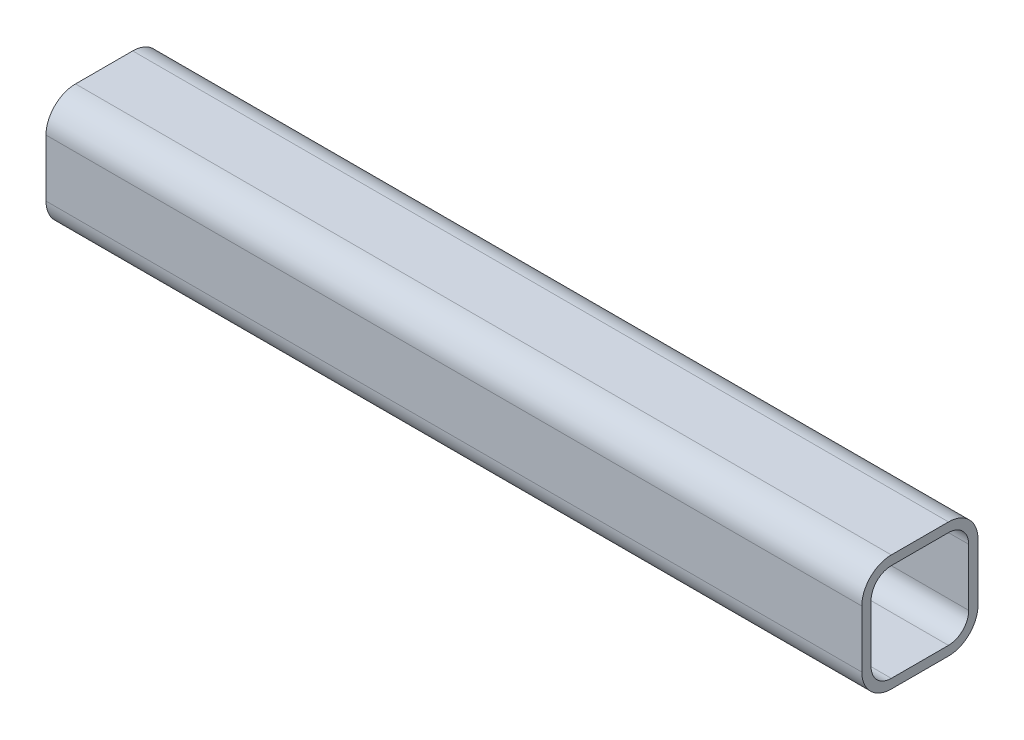
ISO-10303-21;
HEADER;
FILE_DESCRIPTION(('STEP AP214'),'2;1');
FILE_NAME('part.step','',(''),(''),'','','');
FILE_SCHEMA(('AUTOMOTIVE_DESIGN { 1 0 10303 214 1 1 1 1 }'));
ENDSEC;
DATA;
#1=APPLICATION_CONTEXT('core data for automotive mechanical design processes');
#2=APPLICATION_PROTOCOL_DEFINITION('international standard','automotive_design',2000,#1);
#3=PRODUCT_CONTEXT('',#1,'mechanical');
#4=PRODUCT('Part','Part','',(#3));
#5=PRODUCT_RELATED_PRODUCT_CATEGORY('part','',(#4));
#6=PRODUCT_DEFINITION_FORMATION('','',#4);
#7=PRODUCT_DEFINITION_CONTEXT('part definition',#1,'design');
#8=PRODUCT_DEFINITION('design','',#6,#7);
#9=PRODUCT_DEFINITION_SHAPE('','',#8);
#10=(LENGTH_UNIT() NAMED_UNIT(*) SI_UNIT(.MILLI.,.METRE.));
#11=(NAMED_UNIT(*) PLANE_ANGLE_UNIT() SI_UNIT($,.RADIAN.));
#12=(NAMED_UNIT(*) SI_UNIT($,.STERADIAN.) SOLID_ANGLE_UNIT());
#13=UNCERTAINTY_MEASURE_WITH_UNIT(LENGTH_MEASURE(1.E-05),#10,'distance_accuracy_value','');
#14=(GEOMETRIC_REPRESENTATION_CONTEXT(3) GLOBAL_UNCERTAINTY_ASSIGNED_CONTEXT((#13)) GLOBAL_UNIT_ASSIGNED_CONTEXT((#10,
#11,#12)) REPRESENTATION_CONTEXT('',''));
#15=CARTESIAN_POINT('',(0.,0.,0.));
#16=DIRECTION('',(0.,0.,1.));
#17=DIRECTION('',(1.,0.,0.));
#18=AXIS2_PLACEMENT_3D('',#15,#16,#17);
#19=CARTESIAN_POINT('',(172.691234665611,12.3,12.3));
#20=DIRECTION('',(-1.,0.,0.));
#21=DIRECTION('',(0.,0.,1.));
#22=AXIS2_PLACEMENT_3D('',#19,#20,#21);
#23=CYLINDRICAL_SURFACE('',#22,12.7);
#24=CARTESIAN_POINT('',(-178.308765334389,12.3,12.3));
#25=DIRECTION('',(1.,0.,0.));
#26=DIRECTION('',(0.,0.,-1.));
#27=AXIS2_PLACEMENT_3D('',#24,#25,#26);
#28=CIRCLE('',#27,12.7);
#29=CARTESIAN_POINT('',(-178.308765334389,25.,12.3));
#30=VERTEX_POINT('',#29);
#31=CARTESIAN_POINT('',(-178.308765334389,12.3,25.));
#32=VERTEX_POINT('',#31);
#33=EDGE_CURVE('E238',#30,#32,#28,.T.);
#34=ORIENTED_EDGE('',*,*,#33,.T.);
#35=DIRECTION('',(-1.,0.,0.));
#36=VECTOR('',#35,1.);
#37=CARTESIAN_POINT('',(172.691234665611,12.3,25.));
#38=LINE('',#37,#36);
#39=CARTESIAN_POINT('',(172.691234665611,12.3,25.));
#40=VERTEX_POINT('',#39);
#41=EDGE_CURVE('E12',#40,#32,#38,.T.);
#42=ORIENTED_EDGE('',*,*,#41,.F.);
#43=CARTESIAN_POINT('',(172.691234665611,12.3,12.3));
#44=DIRECTION('',(1.,0.,0.));
#45=DIRECTION('',(0.,0.,-1.));
#46=AXIS2_PLACEMENT_3D('',#43,#44,#45);
#47=CIRCLE('',#46,12.7);
#48=CARTESIAN_POINT('',(172.691234665611,25.,12.3));
#49=VERTEX_POINT('',#48);
#50=EDGE_CURVE('E316',#49,#40,#47,.T.);
#51=ORIENTED_EDGE('',*,*,#50,.F.);
#52=DIRECTION('',(-1.,0.,0.));
#53=VECTOR('',#52,1.);
#54=CARTESIAN_POINT('',(172.691234665611,25.,12.3));
#55=LINE('',#54,#53);
#56=EDGE_CURVE('E253',#49,#30,#55,.T.);
#57=ORIENTED_EDGE('',*,*,#56,.T.);
#58=EDGE_LOOP('',(#34,#42,#51,#57));
#59=FACE_BOUND('',#58,.T.);
#60=ADVANCED_FACE('F66',(#59),#23,.T.);
#61=CARTESIAN_POINT('',(172.691234665611,12.3,25.));
#62=DIRECTION('',(0.,0.,-1.));
#63=DIRECTION('',(-1.,0.,0.));
#64=AXIS2_PLACEMENT_3D('',#61,#62,#63);
#65=PLANE('',#64);
#66=DIRECTION('',(0.,-1.,0.));
#67=VECTOR('',#66,1.);
#68=CARTESIAN_POINT('',(-178.308765334389,12.3,25.));
#69=LINE('',#68,#67);
#70=CARTESIAN_POINT('',(-178.308765334389,-12.3,25.));
#71=VERTEX_POINT('',#70);
#72=EDGE_CURVE('E241',#32,#71,#69,.T.);
#73=ORIENTED_EDGE('',*,*,#72,.T.);
#74=DIRECTION('',(-1.,0.,0.));
#75=VECTOR('',#74,1.);
#76=CARTESIAN_POINT('',(172.691234665611,-12.3,25.));
#77=LINE('',#76,#75);
#78=CARTESIAN_POINT('',(172.691234665611,-12.3,25.));
#79=VERTEX_POINT('',#78);
#80=EDGE_CURVE('E76',#79,#71,#77,.T.);
#81=ORIENTED_EDGE('',*,*,#80,.F.);
#82=DIRECTION('',(0.,-1.,0.));
#83=VECTOR('',#82,1.);
#84=CARTESIAN_POINT('',(172.691234665611,12.3,25.));
#85=LINE('',#84,#83);
#86=EDGE_CURVE('E318',#40,#79,#85,.T.);
#87=ORIENTED_EDGE('',*,*,#86,.F.);
#88=ORIENTED_EDGE('',*,*,#41,.T.);
#89=EDGE_LOOP('',(#73,#81,#87,#88));
#90=FACE_BOUND('',#89,.T.);
#91=ADVANCED_FACE('F353',(#90),#65,.F.);
#92=CARTESIAN_POINT('',(172.691234665611,-12.3,12.3));
#93=DIRECTION('',(-1.,0.,0.));
#94=DIRECTION('',(0.,0.,1.));
#95=AXIS2_PLACEMENT_3D('',#92,#93,#94);
#96=CYLINDRICAL_SURFACE('',#95,12.7);
#97=CARTESIAN_POINT('',(-178.308765334389,-12.3,12.3));
#98=DIRECTION('',(1.,0.,0.));
#99=DIRECTION('',(0.,0.,-1.));
#100=AXIS2_PLACEMENT_3D('',#97,#98,#99);
#101=CIRCLE('',#100,12.7);
#102=CARTESIAN_POINT('',(-178.308765334389,-25.,12.3));
#103=VERTEX_POINT('',#102);
#104=EDGE_CURVE('E243',#71,#103,#101,.T.);
#105=ORIENTED_EDGE('',*,*,#104,.T.);
#106=DIRECTION('',(-1.,0.,0.));
#107=VECTOR('',#106,1.);
#108=CARTESIAN_POINT('',(172.691234665611,-25.,12.3));
#109=LINE('',#108,#107);
#110=CARTESIAN_POINT('',(172.691234665611,-25.,12.3));
#111=VERTEX_POINT('',#110);
#112=EDGE_CURVE('E260',#111,#103,#109,.T.);
#113=ORIENTED_EDGE('',*,*,#112,.F.);
#114=CARTESIAN_POINT('',(172.691234665611,-12.3,12.3));
#115=DIRECTION('',(1.,0.,0.));
#116=DIRECTION('',(0.,0.,-1.));
#117=AXIS2_PLACEMENT_3D('',#114,#115,#116);
#118=CIRCLE('',#117,12.7);
#119=EDGE_CURVE('E320',#79,#111,#118,.T.);
#120=ORIENTED_EDGE('',*,*,#119,.F.);
#121=ORIENTED_EDGE('',*,*,#80,.T.);
#122=EDGE_LOOP('',(#105,#113,#120,#121));
#123=FACE_BOUND('',#122,.T.);
#124=ADVANCED_FACE('F358',(#123),#96,.T.);
#125=CARTESIAN_POINT('',(172.691234665611,-25.,-12.3));
#126=DIRECTION('',(0.,1.,0.));
#127=DIRECTION('',(0.,0.,1.));
#128=AXIS2_PLACEMENT_3D('',#125,#126,#127);
#129=PLANE('',#128);
#130=DIRECTION('',(0.,0.,-1.));
#131=VECTOR('',#130,1.);
#132=CARTESIAN_POINT('',(-178.308765334389,-25.,-12.3));
#133=LINE('',#132,#131);
#134=CARTESIAN_POINT('',(-178.308765334389,-25.,-12.3));
#135=VERTEX_POINT('',#134);
#136=EDGE_CURVE('E245',#103,#135,#133,.T.);
#137=ORIENTED_EDGE('',*,*,#136,.T.);
#138=DIRECTION('',(-1.,0.,0.));
#139=VECTOR('',#138,1.);
#140=CARTESIAN_POINT('',(172.691234665611,-25.,-12.3));
#141=LINE('',#140,#139);
#142=CARTESIAN_POINT('',(172.691234665611,-25.,-12.3));
#143=VERTEX_POINT('',#142);
#144=EDGE_CURVE('E257',#143,#135,#141,.T.);
#145=ORIENTED_EDGE('',*,*,#144,.F.);
#146=DIRECTION('',(0.,0.,-1.));
#147=VECTOR('',#146,1.);
#148=CARTESIAN_POINT('',(172.691234665611,-25.,-12.3));
#149=LINE('',#148,#147);
#150=EDGE_CURVE('E322',#111,#143,#149,.T.);
#151=ORIENTED_EDGE('',*,*,#150,.F.);
#152=ORIENTED_EDGE('',*,*,#112,.T.);
#153=EDGE_LOOP('',(#137,#145,#151,#152));
#154=FACE_BOUND('',#153,.T.);
#155=ADVANCED_FACE('F328',(#154),#129,.F.);
#156=CARTESIAN_POINT('',(172.691234665611,-12.3,-12.3));
#157=DIRECTION('',(-1.,0.,0.));
#158=DIRECTION('',(0.,0.,1.));
#159=AXIS2_PLACEMENT_3D('',#156,#157,#158);
#160=CYLINDRICAL_SURFACE('',#159,12.7);
#161=CARTESIAN_POINT('',(-178.308765334389,-12.3,-12.3));
#162=DIRECTION('',(1.,0.,0.));
#163=DIRECTION('',(0.,0.,-1.));
#164=AXIS2_PLACEMENT_3D('',#161,#162,#163);
#165=CIRCLE('',#164,12.7);
#166=CARTESIAN_POINT('',(-178.308765334389,-12.3,-25.));
#167=VERTEX_POINT('',#166);
#168=EDGE_CURVE('E247',#135,#167,#165,.T.);
#169=ORIENTED_EDGE('',*,*,#168,.T.);
#170=DIRECTION('',(-1.,0.,0.));
#171=VECTOR('',#170,1.);
#172=CARTESIAN_POINT('',(172.691234665611,-12.3,-25.));
#173=LINE('',#172,#171);
#174=CARTESIAN_POINT('',(172.691234665611,-12.3,-25.));
#175=VERTEX_POINT('',#174);
#176=EDGE_CURVE('E205',#175,#167,#173,.T.);
#177=ORIENTED_EDGE('',*,*,#176,.F.);
#178=CARTESIAN_POINT('',(172.691234665611,-12.3,-12.3));
#179=DIRECTION('',(1.,0.,0.));
#180=DIRECTION('',(0.,0.,-1.));
#181=AXIS2_PLACEMENT_3D('',#178,#179,#180);
#182=CIRCLE('',#181,12.7);
#183=EDGE_CURVE('E196',#143,#175,#182,.T.);
#184=ORIENTED_EDGE('',*,*,#183,.F.);
#185=ORIENTED_EDGE('',*,*,#144,.T.);
#186=EDGE_LOOP('',(#169,#177,#184,#185));
#187=FACE_BOUND('',#186,.T.);
#188=ADVANCED_FACE('F332',(#187),#160,.T.);
#189=CARTESIAN_POINT('',(172.691234665611,-12.3,-25.));
#190=DIRECTION('',(0.,0.,1.));
#191=DIRECTION('',(1.,0.,0.));
#192=AXIS2_PLACEMENT_3D('',#189,#190,#191);
#193=PLANE('',#192);
#194=DIRECTION('',(0.,1.,0.));
#195=VECTOR('',#194,1.);
#196=CARTESIAN_POINT('',(-178.308765334389,-12.3,-25.));
#197=LINE('',#196,#195);
#198=CARTESIAN_POINT('',(-178.308765334389,12.3,-25.));
#199=VERTEX_POINT('',#198);
#200=EDGE_CURVE('E204',#167,#199,#197,.T.);
#201=ORIENTED_EDGE('',*,*,#200,.T.);
#202=DIRECTION('',(-1.,0.,0.));
#203=VECTOR('',#202,1.);
#204=CARTESIAN_POINT('',(172.691234665611,12.3,-25.));
#205=LINE('',#204,#203);
#206=CARTESIAN_POINT('',(172.691234665611,12.3,-25.));
#207=VERTEX_POINT('',#206);
#208=EDGE_CURVE('E201',#207,#199,#205,.T.);
#209=ORIENTED_EDGE('',*,*,#208,.F.);
#210=DIRECTION('',(0.,1.,0.));
#211=VECTOR('',#210,1.);
#212=CARTESIAN_POINT('',(172.691234665611,-12.3,-25.));
#213=LINE('',#212,#211);
#214=EDGE_CURVE('E190',#175,#207,#213,.T.);
#215=ORIENTED_EDGE('',*,*,#214,.F.);
#216=ORIENTED_EDGE('',*,*,#176,.T.);
#217=EDGE_LOOP('',(#201,#209,#215,#216));
#218=FACE_BOUND('',#217,.T.);
#219=ADVANCED_FACE('F202',(#218),#193,.F.);
#220=CARTESIAN_POINT('',(172.691234665611,12.3,-12.3));
#221=DIRECTION('',(-1.,0.,0.));
#222=DIRECTION('',(0.,0.,1.));
#223=AXIS2_PLACEMENT_3D('',#220,#221,#222);
#224=CYLINDRICAL_SURFACE('',#223,12.7);
#225=CARTESIAN_POINT('',(-178.308765334389,12.3,-12.3));
#226=DIRECTION('',(1.,0.,0.));
#227=DIRECTION('',(0.,0.,-1.));
#228=AXIS2_PLACEMENT_3D('',#225,#226,#227);
#229=CIRCLE('',#228,12.7);
#230=CARTESIAN_POINT('',(-178.308765334389,25.,-12.3));
#231=VERTEX_POINT('',#230);
#232=EDGE_CURVE('E138',#199,#231,#229,.T.);
#233=ORIENTED_EDGE('',*,*,#232,.T.);
#234=DIRECTION('',(-1.,0.,0.));
#235=VECTOR('',#234,1.);
#236=CARTESIAN_POINT('',(172.691234665611,25.,-12.3));
#237=LINE('',#236,#235);
#238=CARTESIAN_POINT('',(172.691234665611,25.,-12.3));
#239=VERTEX_POINT('',#238);
#240=EDGE_CURVE('E206',#239,#231,#237,.T.);
#241=ORIENTED_EDGE('',*,*,#240,.F.);
#242=CARTESIAN_POINT('',(172.691234665611,12.3,-12.3));
#243=DIRECTION('',(1.,0.,0.));
#244=DIRECTION('',(0.,0.,-1.));
#245=AXIS2_PLACEMENT_3D('',#242,#243,#244);
#246=CIRCLE('',#245,12.7);
#247=EDGE_CURVE('E194',#207,#239,#246,.T.);
#248=ORIENTED_EDGE('',*,*,#247,.F.);
#249=ORIENTED_EDGE('',*,*,#208,.T.);
#250=EDGE_LOOP('',(#233,#241,#248,#249));
#251=FACE_BOUND('',#250,.T.);
#252=ADVANCED_FACE('F208',(#251),#224,.T.);
#253=CARTESIAN_POINT('',(172.691234665611,-12.3,12.3));
#254=DIRECTION('',(-1.,0.,0.));
#255=DIRECTION('',(0.,0.,1.));
#256=AXIS2_PLACEMENT_3D('',#253,#254,#255);
#257=CYLINDRICAL_SURFACE('',#256,8.7);
#258=CARTESIAN_POINT('',(-178.308765334389,-12.3,12.3));
#259=DIRECTION('',(1.,0.,0.));
#260=DIRECTION('',(0.,0.,-1.));
#261=AXIS2_PLACEMENT_3D('',#258,#259,#260);
#262=CIRCLE('',#261,8.7);
#263=CARTESIAN_POINT('',(-178.308765334389,-12.3,21.));
#264=VERTEX_POINT('',#263);
#265=CARTESIAN_POINT('',(-178.308765334389,-21.,12.3));
#266=VERTEX_POINT('',#265);
#267=EDGE_CURVE('E214',#264,#266,#262,.T.);
#268=ORIENTED_EDGE('',*,*,#267,.F.);
#269=DIRECTION('',(-1.,0.,0.));
#270=VECTOR('',#269,1.);
#271=CARTESIAN_POINT('',(172.691234665611,-12.3,21.));
#272=LINE('',#271,#270);
#273=CARTESIAN_POINT('',(172.691234665611,-12.3,21.));
#274=VERTEX_POINT('',#273);
#275=EDGE_CURVE('E70',#274,#264,#272,.T.);
#276=ORIENTED_EDGE('',*,*,#275,.F.);
#277=CARTESIAN_POINT('',(172.691234665611,-12.3,12.3));
#278=DIRECTION('',(1.,0.,0.));
#279=DIRECTION('',(0.,0.,-1.));
#280=AXIS2_PLACEMENT_3D('',#277,#278,#279);
#281=CIRCLE('',#280,8.7);
#282=CARTESIAN_POINT('',(172.691234665611,-21.,12.3));
#283=VERTEX_POINT('',#282);
#284=EDGE_CURVE('E252',#274,#283,#281,.T.);
#285=ORIENTED_EDGE('',*,*,#284,.T.);
#286=DIRECTION('',(-1.,0.,0.));
#287=VECTOR('',#286,1.);
#288=CARTESIAN_POINT('',(172.691234665611,-21.,12.3));
#289=LINE('',#288,#287);
#290=EDGE_CURVE('E210',#283,#266,#289,.T.);
#291=ORIENTED_EDGE('',*,*,#290,.T.);
#292=EDGE_LOOP('',(#268,#276,#285,#291));
#293=FACE_BOUND('',#292,.T.);
#294=ADVANCED_FACE('F68',(#293),#257,.F.);
#295=CARTESIAN_POINT('',(172.691234665611,12.3,21.));
#296=DIRECTION('',(0.,0.,-1.));
#297=DIRECTION('',(-1.,0.,0.));
#298=AXIS2_PLACEMENT_3D('',#295,#296,#297);
#299=PLANE('',#298);
#300=DIRECTION('',(0.,-1.,0.));
#301=VECTOR('',#300,1.);
#302=CARTESIAN_POINT('',(-178.308765334389,12.3,21.));
#303=LINE('',#302,#301);
#304=CARTESIAN_POINT('',(-178.308765334389,12.3,21.));
#305=VERTEX_POINT('',#304);
#306=EDGE_CURVE('E217',#305,#264,#303,.T.);
#307=ORIENTED_EDGE('',*,*,#306,.F.);
#308=DIRECTION('',(-1.,0.,0.));
#309=VECTOR('',#308,1.);
#310=CARTESIAN_POINT('',(172.691234665611,12.3,21.));
#311=LINE('',#310,#309);
#312=CARTESIAN_POINT('',(172.691234665611,12.3,21.));
#313=VERTEX_POINT('',#312);
#314=EDGE_CURVE('E275',#313,#305,#311,.T.);
#315=ORIENTED_EDGE('',*,*,#314,.F.);
#316=DIRECTION('',(0.,-1.,0.));
#317=VECTOR('',#316,1.);
#318=CARTESIAN_POINT('',(172.691234665611,12.3,21.));
#319=LINE('',#318,#317);
#320=EDGE_CURVE('E284',#313,#274,#319,.T.);
#321=ORIENTED_EDGE('',*,*,#320,.T.);
#322=ORIENTED_EDGE('',*,*,#275,.T.);
#323=EDGE_LOOP('',(#307,#315,#321,#322));
#324=FACE_BOUND('',#323,.T.);
#325=ADVANCED_FACE('F282',(#324),#299,.T.);
#326=CARTESIAN_POINT('',(172.691234665611,12.3,12.3));
#327=DIRECTION('',(-1.,0.,0.));
#328=DIRECTION('',(0.,0.,1.));
#329=AXIS2_PLACEMENT_3D('',#326,#327,#328);
#330=CYLINDRICAL_SURFACE('',#329,8.7);
#331=CARTESIAN_POINT('',(-178.308765334389,12.3,12.3));
#332=DIRECTION('',(1.,0.,0.));
#333=DIRECTION('',(0.,0.,-1.));
#334=AXIS2_PLACEMENT_3D('',#331,#332,#333);
#335=CIRCLE('',#334,8.7);
#336=CARTESIAN_POINT('',(-178.308765334389,21.,12.3));
#337=VERTEX_POINT('',#336);
#338=EDGE_CURVE('E220',#337,#305,#335,.T.);
#339=ORIENTED_EDGE('',*,*,#338,.F.);
#340=DIRECTION('',(-1.,0.,0.));
#341=VECTOR('',#340,1.);
#342=CARTESIAN_POINT('',(172.691234665611,21.,12.3));
#343=LINE('',#342,#341);
#344=CARTESIAN_POINT('',(172.691234665611,21.,12.3));
#345=VERTEX_POINT('',#344);
#346=EDGE_CURVE('E274',#345,#337,#343,.T.);
#347=ORIENTED_EDGE('',*,*,#346,.F.);
#348=CARTESIAN_POINT('',(172.691234665611,12.3,12.3));
#349=DIRECTION('',(1.,0.,0.));
#350=DIRECTION('',(0.,0.,-1.));
#351=AXIS2_PLACEMENT_3D('',#348,#349,#350);
#352=CIRCLE('',#351,8.7);
#353=EDGE_CURVE('E292',#345,#313,#352,.T.);
#354=ORIENTED_EDGE('',*,*,#353,.T.);
#355=ORIENTED_EDGE('',*,*,#314,.T.);
#356=EDGE_LOOP('',(#339,#347,#354,#355));
#357=FACE_BOUND('',#356,.T.);
#358=ADVANCED_FACE('F290',(#357),#330,.F.);
#359=CARTESIAN_POINT('',(172.691234665611,21.,12.3));
#360=DIRECTION('',(0.,-1.,0.));
#361=DIRECTION('',(0.,0.,-1.));
#362=AXIS2_PLACEMENT_3D('',#359,#360,#361);
#363=PLANE('',#362);
#364=DIRECTION('',(0.,0.,1.));
#365=VECTOR('',#364,1.);
#366=CARTESIAN_POINT('',(-178.308765334389,21.,12.3));
#367=LINE('',#366,#365);
#368=CARTESIAN_POINT('',(-178.308765334389,21.,-12.3));
#369=VERTEX_POINT('',#368);
#370=EDGE_CURVE('E223',#369,#337,#367,.T.);
#371=ORIENTED_EDGE('',*,*,#370,.F.);
#372=DIRECTION('',(-1.,0.,0.));
#373=VECTOR('',#372,1.);
#374=CARTESIAN_POINT('',(172.691234665611,21.,-12.3));
#375=LINE('',#374,#373);
#376=CARTESIAN_POINT('',(172.691234665611,21.,-12.3));
#377=VERTEX_POINT('',#376);
#378=EDGE_CURVE('E272',#377,#369,#375,.T.);
#379=ORIENTED_EDGE('',*,*,#378,.F.);
#380=DIRECTION('',(0.,0.,1.));
#381=VECTOR('',#380,1.);
#382=CARTESIAN_POINT('',(172.691234665611,21.,12.3));
#383=LINE('',#382,#381);
#384=EDGE_CURVE('E298',#377,#345,#383,.T.);
#385=ORIENTED_EDGE('',*,*,#384,.T.);
#386=ORIENTED_EDGE('',*,*,#346,.T.);
#387=EDGE_LOOP('',(#371,#379,#385,#386));
#388=FACE_BOUND('',#387,.T.);
#389=ADVANCED_FACE('F301',(#388),#363,.T.);
#390=CARTESIAN_POINT('',(172.691234665611,12.3,-12.3));
#391=DIRECTION('',(-1.,0.,0.));
#392=DIRECTION('',(0.,0.,1.));
#393=AXIS2_PLACEMENT_3D('',#390,#391,#392);
#394=CYLINDRICAL_SURFACE('',#393,8.7);
#395=CARTESIAN_POINT('',(-178.308765334389,12.3,-12.3));
#396=DIRECTION('',(1.,0.,0.));
#397=DIRECTION('',(0.,0.,-1.));
#398=AXIS2_PLACEMENT_3D('',#395,#396,#397);
#399=CIRCLE('',#398,8.7);
#400=CARTESIAN_POINT('',(-178.308765334389,12.3,-21.));
#401=VERTEX_POINT('',#400);
#402=EDGE_CURVE('E226',#401,#369,#399,.T.);
#403=ORIENTED_EDGE('',*,*,#402,.F.);
#404=DIRECTION('',(-1.,0.,0.));
#405=VECTOR('',#404,1.);
#406=CARTESIAN_POINT('',(172.691234665611,12.3,-21.));
#407=LINE('',#406,#405);
#408=CARTESIAN_POINT('',(172.691234665611,12.3,-21.));
#409=VERTEX_POINT('',#408);
#410=EDGE_CURVE('E270',#409,#401,#407,.T.);
#411=ORIENTED_EDGE('',*,*,#410,.F.);
#412=CARTESIAN_POINT('',(172.691234665611,12.3,-12.3));
#413=DIRECTION('',(1.,0.,0.));
#414=DIRECTION('',(0.,0.,-1.));
#415=AXIS2_PLACEMENT_3D('',#412,#413,#414);
#416=CIRCLE('',#415,8.7);
#417=EDGE_CURVE('E302',#409,#377,#416,.T.);
#418=ORIENTED_EDGE('',*,*,#417,.T.);
#419=ORIENTED_EDGE('',*,*,#378,.T.);
#420=EDGE_LOOP('',(#403,#411,#418,#419));
#421=FACE_BOUND('',#420,.T.);
#422=ADVANCED_FACE('F369',(#421),#394,.F.);
#423=CARTESIAN_POINT('',(172.691234665611,-12.3,-21.));
#424=DIRECTION('',(0.,0.,1.));
#425=DIRECTION('',(1.,0.,0.));
#426=AXIS2_PLACEMENT_3D('',#423,#424,#425);
#427=PLANE('',#426);
#428=DIRECTION('',(0.,1.,0.));
#429=VECTOR('',#428,1.);
#430=CARTESIAN_POINT('',(-178.308765334389,-12.3,-21.));
#431=LINE('',#430,#429);
#432=CARTESIAN_POINT('',(-178.308765334389,-12.3,-21.));
#433=VERTEX_POINT('',#432);
#434=EDGE_CURVE('E229',#433,#401,#431,.T.);
#435=ORIENTED_EDGE('',*,*,#434,.F.);
#436=DIRECTION('',(-1.,0.,0.));
#437=VECTOR('',#436,1.);
#438=CARTESIAN_POINT('',(172.691234665611,-12.3,-21.));
#439=LINE('',#438,#437);
#440=CARTESIAN_POINT('',(172.691234665611,-12.3,-21.));
#441=VERTEX_POINT('',#440);
#442=EDGE_CURVE('E268',#441,#433,#439,.T.);
#443=ORIENTED_EDGE('',*,*,#442,.F.);
#444=DIRECTION('',(0.,1.,0.));
#445=VECTOR('',#444,1.);
#446=CARTESIAN_POINT('',(172.691234665611,-12.3,-21.));
#447=LINE('',#446,#445);
#448=EDGE_CURVE('E304',#441,#409,#447,.T.);
#449=ORIENTED_EDGE('',*,*,#448,.T.);
#450=ORIENTED_EDGE('',*,*,#410,.T.);
#451=EDGE_LOOP('',(#435,#443,#449,#450));
#452=FACE_BOUND('',#451,.T.);
#453=ADVANCED_FACE('F365',(#452),#427,.T.);
#454=CARTESIAN_POINT('',(172.691234665611,-12.3,-12.3));
#455=DIRECTION('',(-1.,0.,0.));
#456=DIRECTION('',(0.,0.,1.));
#457=AXIS2_PLACEMENT_3D('',#454,#455,#456);
#458=CYLINDRICAL_SURFACE('',#457,8.7);
#459=CARTESIAN_POINT('',(-178.308765334389,-12.3,-12.3));
#460=DIRECTION('',(1.,0.,0.));
#461=DIRECTION('',(0.,0.,-1.));
#462=AXIS2_PLACEMENT_3D('',#459,#460,#461);
#463=CIRCLE('',#462,8.7);
#464=CARTESIAN_POINT('',(-178.308765334389,-21.,-12.3));
#465=VERTEX_POINT('',#464);
#466=EDGE_CURVE('E232',#465,#433,#463,.T.);
#467=ORIENTED_EDGE('',*,*,#466,.F.);
#468=DIRECTION('',(-1.,0.,0.));
#469=VECTOR('',#468,1.);
#470=CARTESIAN_POINT('',(172.691234665611,-21.,-12.3));
#471=LINE('',#470,#469);
#472=CARTESIAN_POINT('',(172.691234665611,-21.,-12.3));
#473=VERTEX_POINT('',#472);
#474=EDGE_CURVE('E266',#473,#465,#471,.T.);
#475=ORIENTED_EDGE('',*,*,#474,.F.);
#476=CARTESIAN_POINT('',(172.691234665611,-12.3,-12.3));
#477=DIRECTION('',(1.,0.,0.));
#478=DIRECTION('',(0.,0.,-1.));
#479=AXIS2_PLACEMENT_3D('',#476,#477,#478);
#480=CIRCLE('',#479,8.7);
#481=EDGE_CURVE('E310',#473,#441,#480,.T.);
#482=ORIENTED_EDGE('',*,*,#481,.T.);
#483=ORIENTED_EDGE('',*,*,#442,.T.);
#484=EDGE_LOOP('',(#467,#475,#482,#483));
#485=FACE_BOUND('',#484,.T.);
#486=ADVANCED_FACE('F347',(#485),#458,.F.);
#487=CARTESIAN_POINT('',(172.691234665611,-21.,-12.3));
#488=DIRECTION('',(0.,1.,0.));
#489=DIRECTION('',(0.,0.,1.));
#490=AXIS2_PLACEMENT_3D('',#487,#488,#489);
#491=PLANE('',#490);
#492=DIRECTION('',(0.,0.,-1.));
#493=VECTOR('',#492,1.);
#494=CARTESIAN_POINT('',(-178.308765334389,-21.,-12.3));
#495=LINE('',#494,#493);
#496=EDGE_CURVE('E235',#266,#465,#495,.T.);
#497=ORIENTED_EDGE('',*,*,#496,.F.);
#498=ORIENTED_EDGE('',*,*,#290,.F.);
#499=DIRECTION('',(0.,0.,-1.));
#500=VECTOR('',#499,1.);
#501=CARTESIAN_POINT('',(172.691234665611,-21.,-12.3));
#502=LINE('',#501,#500);
#503=EDGE_CURVE('E313',#283,#473,#502,.T.);
#504=ORIENTED_EDGE('',*,*,#503,.T.);
#505=ORIENTED_EDGE('',*,*,#474,.T.);
#506=EDGE_LOOP('',(#497,#498,#504,#505));
#507=FACE_BOUND('',#506,.T.);
#508=ADVANCED_FACE('F340',(#507),#491,.T.);
#509=CARTESIAN_POINT('',(172.691234665611,25.,12.3));
#510=DIRECTION('',(0.,-1.,0.));
#511=DIRECTION('',(0.,0.,-1.));
#512=AXIS2_PLACEMENT_3D('',#509,#510,#511);
#513=PLANE('',#512);
#514=DIRECTION('',(0.,0.,1.));
#515=VECTOR('',#514,1.);
#516=CARTESIAN_POINT('',(-178.308765334389,25.,12.3));
#517=LINE('',#516,#515);
#518=EDGE_CURVE('E144',#231,#30,#517,.T.);
#519=ORIENTED_EDGE('',*,*,#518,.T.);
#520=ORIENTED_EDGE('',*,*,#56,.F.);
#521=DIRECTION('',(0.,0.,1.));
#522=VECTOR('',#521,1.);
#523=CARTESIAN_POINT('',(172.691234665611,25.,12.3));
#524=LINE('',#523,#522);
#525=EDGE_CURVE('E85',#239,#49,#524,.T.);
#526=ORIENTED_EDGE('',*,*,#525,.F.);
#527=ORIENTED_EDGE('',*,*,#240,.T.);
#528=EDGE_LOOP('',(#519,#520,#526,#527));
#529=FACE_BOUND('',#528,.T.);
#530=ADVANCED_FACE('F338',(#529),#513,.F.);
#531=CARTESIAN_POINT('',(172.691234665611,12.3,12.3));
#532=DIRECTION('',(1.,0.,0.));
#533=DIRECTION('',(0.,0.,-1.));
#534=AXIS2_PLACEMENT_3D('',#531,#532,#533);
#535=PLANE('',#534);
#536=ORIENTED_EDGE('',*,*,#284,.F.);
#537=ORIENTED_EDGE('',*,*,#320,.F.);
#538=ORIENTED_EDGE('',*,*,#353,.F.);
#539=ORIENTED_EDGE('',*,*,#384,.F.);
#540=ORIENTED_EDGE('',*,*,#417,.F.);
#541=ORIENTED_EDGE('',*,*,#448,.F.);
#542=ORIENTED_EDGE('',*,*,#481,.F.);
#543=ORIENTED_EDGE('',*,*,#503,.F.);
#544=EDGE_LOOP('',(#536,#537,#538,#539,#540,#541,#542,#543));
#545=FACE_BOUND('',#544,.T.);
#546=ORIENTED_EDGE('',*,*,#50,.T.);
#547=ORIENTED_EDGE('',*,*,#86,.T.);
#548=ORIENTED_EDGE('',*,*,#119,.T.);
#549=ORIENTED_EDGE('',*,*,#150,.T.);
#550=ORIENTED_EDGE('',*,*,#183,.T.);
#551=ORIENTED_EDGE('',*,*,#214,.T.);
#552=ORIENTED_EDGE('',*,*,#247,.T.);
#553=ORIENTED_EDGE('',*,*,#525,.T.);
#554=EDGE_LOOP('',(#546,#547,#548,#549,#550,#551,#552,#553));
#555=FACE_BOUND('',#554,.T.);
#556=ADVANCED_FACE('F192',(#545,#555),#535,.T.);
#557=CARTESIAN_POINT('',(-178.308765334389,12.3,12.3));
#558=DIRECTION('',(1.,0.,0.));
#559=DIRECTION('',(0.,0.,-1.));
#560=AXIS2_PLACEMENT_3D('',#557,#558,#559);
#561=PLANE('',#560);
#562=ORIENTED_EDGE('',*,*,#267,.T.);
#563=ORIENTED_EDGE('',*,*,#496,.T.);
#564=ORIENTED_EDGE('',*,*,#466,.T.);
#565=ORIENTED_EDGE('',*,*,#434,.T.);
#566=ORIENTED_EDGE('',*,*,#402,.T.);
#567=ORIENTED_EDGE('',*,*,#370,.T.);
#568=ORIENTED_EDGE('',*,*,#338,.T.);
#569=ORIENTED_EDGE('',*,*,#306,.T.);
#570=EDGE_LOOP('',(#562,#563,#564,#565,#566,#567,#568,#569));
#571=FACE_BOUND('',#570,.T.);
#572=ORIENTED_EDGE('',*,*,#33,.F.);
#573=ORIENTED_EDGE('',*,*,#518,.F.);
#574=ORIENTED_EDGE('',*,*,#232,.F.);
#575=ORIENTED_EDGE('',*,*,#200,.F.);
#576=ORIENTED_EDGE('',*,*,#168,.F.);
#577=ORIENTED_EDGE('',*,*,#136,.F.);
#578=ORIENTED_EDGE('',*,*,#104,.F.);
#579=ORIENTED_EDGE('',*,*,#72,.F.);
#580=EDGE_LOOP('',(#572,#573,#574,#575,#576,#577,#578,#579));
#581=FACE_BOUND('',#580,.T.);
#582=ADVANCED_FACE('F287',(#571,#581),#561,.F.);
#583=CLOSED_SHELL('',(#60,#91,#124,#155,#188,#219,#252,#294,#325,#358,#389,#422,#453,#486,#508,
#530,#556,#582));
#584=MANIFOLD_SOLID_BREP('B2',#583);
#585=ADVANCED_BREP_SHAPE_REPRESENTATION('',(#18,#584),#14);
#586=SHAPE_DEFINITION_REPRESENTATION(#9,#585);
ENDSEC;
END-ISO-10303-21;
